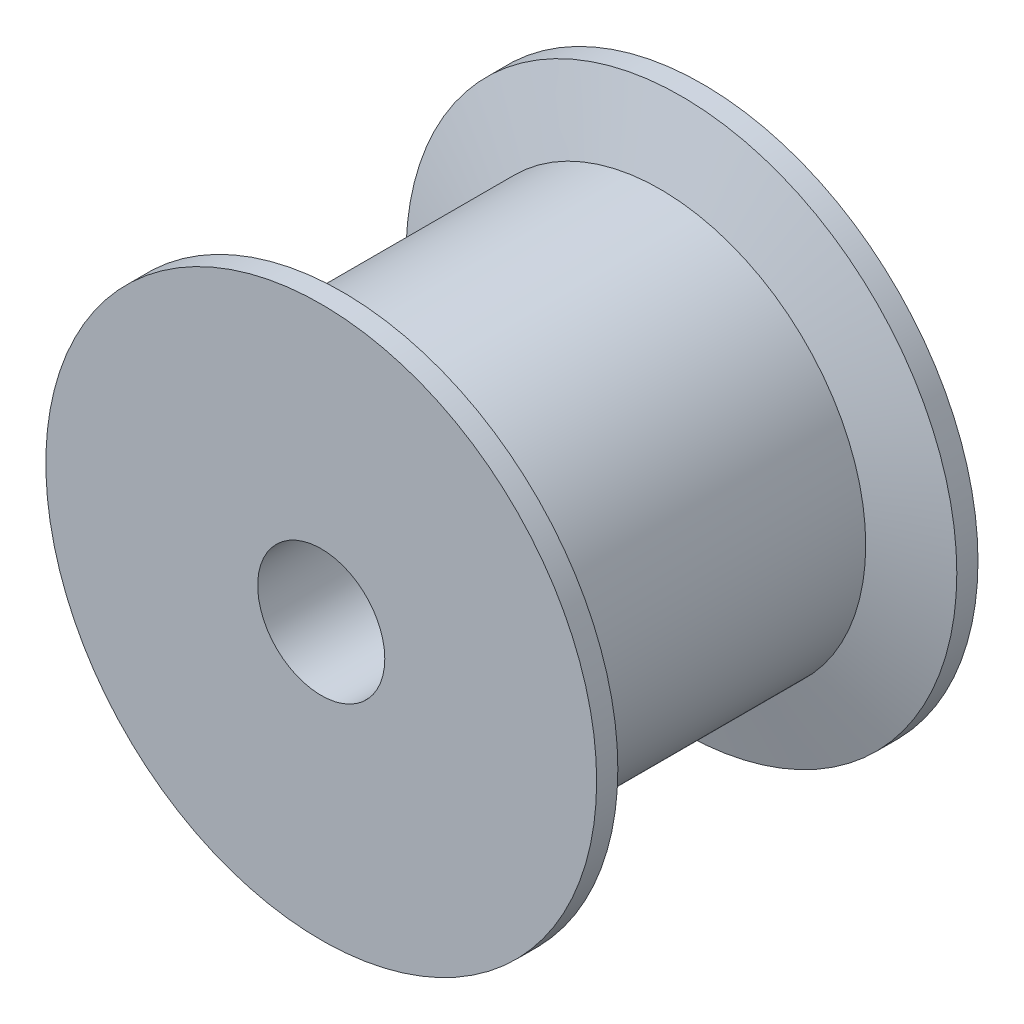
ISO-10303-21;
HEADER;
FILE_DESCRIPTION(('STEP AP214'),'2;1');
FILE_NAME('part.step','',(''),(''),'','','');
FILE_SCHEMA(('AUTOMOTIVE_DESIGN { 1 0 10303 214 1 1 1 1 }'));
ENDSEC;
DATA;
#1=APPLICATION_CONTEXT('core data for automotive mechanical design processes');
#2=APPLICATION_PROTOCOL_DEFINITION('international standard','automotive_design',2000,#1);
#3=PRODUCT_CONTEXT('',#1,'mechanical');
#4=PRODUCT('Part','Part','',(#3));
#5=PRODUCT_RELATED_PRODUCT_CATEGORY('part','',(#4));
#6=PRODUCT_DEFINITION_FORMATION('','',#4);
#7=PRODUCT_DEFINITION_CONTEXT('part definition',#1,'design');
#8=PRODUCT_DEFINITION('design','',#6,#7);
#9=PRODUCT_DEFINITION_SHAPE('','',#8);
#10=(LENGTH_UNIT() NAMED_UNIT(*) SI_UNIT(.MILLI.,.METRE.));
#11=(NAMED_UNIT(*) PLANE_ANGLE_UNIT() SI_UNIT($,.RADIAN.));
#12=(NAMED_UNIT(*) SI_UNIT($,.STERADIAN.) SOLID_ANGLE_UNIT());
#13=UNCERTAINTY_MEASURE_WITH_UNIT(LENGTH_MEASURE(1.E-05),#10,'distance_accuracy_value','');
#14=(GEOMETRIC_REPRESENTATION_CONTEXT(3) GLOBAL_UNCERTAINTY_ASSIGNED_CONTEXT((#13)) GLOBAL_UNIT_ASSIGNED_CONTEXT((#10,
#11,#12)) REPRESENTATION_CONTEXT('',''));
#15=CARTESIAN_POINT('',(0.,0.,0.));
#16=DIRECTION('',(0.,0.,1.));
#17=DIRECTION('',(1.,0.,0.));
#18=AXIS2_PLACEMENT_3D('',#15,#16,#17);
#19=CARTESIAN_POINT('',(0.,0.,3.5));
#20=DIRECTION('',(0.,0.,1.));
#21=DIRECTION('',(1.,0.,0.));
#22=AXIS2_PLACEMENT_3D('',#19,#20,#21);
#23=CONICAL_SURFACE('',#22,4.85,1.27656176168371);
#24=CARTESIAN_POINT('',(0.,0.,4.));
#25=DIRECTION('',(0.,0.,1.));
#26=DIRECTION('',(1.,0.,0.));
#27=AXIS2_PLACEMENT_3D('',#24,#25,#26);
#28=CIRCLE('',#27,6.5);
#29=CARTESIAN_POINT('',(6.5,0.,4.));
#30=VERTEX_POINT('',#29);
#31=EDGE_CURVE('E72',#30,#30,#28,.T.);
#32=ORIENTED_EDGE('',*,*,#31,.F.);
#33=EDGE_LOOP('',(#32));
#34=FACE_BOUND('',#33,.T.);
#35=CARTESIAN_POINT('',(0.,0.,3.5));
#36=DIRECTION('',(0.,0.,1.));
#37=DIRECTION('',(1.,0.,0.));
#38=AXIS2_PLACEMENT_3D('',#35,#36,#37);
#39=CIRCLE('',#38,4.85);
#40=CARTESIAN_POINT('',(4.85,0.,3.5));
#41=VERTEX_POINT('',#40);
#42=EDGE_CURVE('E10',#41,#41,#39,.T.);
#43=ORIENTED_EDGE('',*,*,#42,.T.);
#44=EDGE_LOOP('',(#43));
#45=FACE_BOUND('',#44,.T.);
#46=ADVANCED_FACE('F37',(#34,#45),#23,.T.);
#47=CARTESIAN_POINT('',(0.,0.,0.));
#48=DIRECTION('',(0.,0.,1.));
#49=DIRECTION('',(1.,0.,0.));
#50=AXIS2_PLACEMENT_3D('',#47,#48,#49);
#51=CYLINDRICAL_SURFACE('',#50,4.85);
#52=ORIENTED_EDGE('',*,*,#42,.F.);
#53=EDGE_LOOP('',(#52));
#54=FACE_BOUND('',#53,.T.);
#55=CARTESIAN_POINT('',(0.,0.,-3.5));
#56=DIRECTION('',(0.,0.,1.));
#57=DIRECTION('',(1.,0.,0.));
#58=AXIS2_PLACEMENT_3D('',#55,#56,#57);
#59=CIRCLE('',#58,4.85);
#60=CARTESIAN_POINT('',(4.85,0.,-3.5));
#61=VERTEX_POINT('',#60);
#62=EDGE_CURVE('E44',#61,#61,#59,.T.);
#63=ORIENTED_EDGE('',*,*,#62,.T.);
#64=EDGE_LOOP('',(#63));
#65=FACE_BOUND('',#64,.T.);
#66=ADVANCED_FACE('F80',(#54,#65),#51,.T.);
#67=CARTESIAN_POINT('',(0.,0.,-4.));
#68=DIRECTION('',(0.,0.,-1.));
#69=DIRECTION('',(-1.,0.,0.));
#70=AXIS2_PLACEMENT_3D('',#67,#68,#69);
#71=CONICAL_SURFACE('',#70,6.5,1.27656176168371);
#72=ORIENTED_EDGE('',*,*,#62,.F.);
#73=EDGE_LOOP('',(#72));
#74=FACE_BOUND('',#73,.T.);
#75=CARTESIAN_POINT('',(0.,0.,-4.));
#76=DIRECTION('',(0.,0.,1.));
#77=DIRECTION('',(1.,0.,0.));
#78=AXIS2_PLACEMENT_3D('',#75,#76,#77);
#79=CIRCLE('',#78,6.5);
#80=CARTESIAN_POINT('',(6.5,0.,-4.));
#81=VERTEX_POINT('',#80);
#82=EDGE_CURVE('E49',#81,#81,#79,.T.);
#83=ORIENTED_EDGE('',*,*,#82,.T.);
#84=EDGE_LOOP('',(#83));
#85=FACE_BOUND('',#84,.T.);
#86=ADVANCED_FACE('F84',(#74,#85),#71,.T.);
#87=CARTESIAN_POINT('',(0.,0.,0.));
#88=DIRECTION('',(0.,0.,1.));
#89=DIRECTION('',(1.,0.,0.));
#90=AXIS2_PLACEMENT_3D('',#87,#88,#89);
#91=CYLINDRICAL_SURFACE('',#90,6.5);
#92=ORIENTED_EDGE('',*,*,#82,.F.);
#93=EDGE_LOOP('',(#92));
#94=FACE_BOUND('',#93,.T.);
#95=CARTESIAN_POINT('',(0.,0.,-4.5));
#96=DIRECTION('',(0.,0.,1.));
#97=DIRECTION('',(1.,0.,0.));
#98=AXIS2_PLACEMENT_3D('',#95,#96,#97);
#99=CIRCLE('',#98,6.5);
#100=CARTESIAN_POINT('',(6.5,0.,-4.5));
#101=VERTEX_POINT('',#100);
#102=EDGE_CURVE('E54',#101,#101,#99,.T.);
#103=ORIENTED_EDGE('',*,*,#102,.T.);
#104=EDGE_LOOP('',(#103));
#105=FACE_BOUND('',#104,.T.);
#106=ADVANCED_FACE('F89',(#94,#105),#91,.T.);
#107=CARTESIAN_POINT('',(0.,1.5,-4.5));
#108=DIRECTION('',(0.,0.,1.));
#109=DIRECTION('',(1.,0.,0.));
#110=AXIS2_PLACEMENT_3D('',#107,#108,#109);
#111=PLANE('',#110);
#112=ORIENTED_EDGE('',*,*,#102,.F.);
#113=EDGE_LOOP('',(#112));
#114=FACE_BOUND('',#113,.T.);
#115=CARTESIAN_POINT('',(0.,0.,-4.5));
#116=DIRECTION('',(0.,0.,1.));
#117=DIRECTION('',(1.,0.,0.));
#118=AXIS2_PLACEMENT_3D('',#115,#116,#117);
#119=CIRCLE('',#118,1.5);
#120=CARTESIAN_POINT('',(1.5,0.,-4.5));
#121=VERTEX_POINT('',#120);
#122=EDGE_CURVE('E60',#121,#121,#119,.T.);
#123=ORIENTED_EDGE('',*,*,#122,.T.);
#124=EDGE_LOOP('',(#123));
#125=FACE_BOUND('',#124,.T.);
#126=ADVANCED_FACE('F95',(#114,#125),#111,.F.);
#127=CARTESIAN_POINT('',(0.,0.,0.));
#128=DIRECTION('',(0.,0.,1.));
#129=DIRECTION('',(1.,0.,0.));
#130=AXIS2_PLACEMENT_3D('',#127,#128,#129);
#131=CYLINDRICAL_SURFACE('',#130,1.5);
#132=ORIENTED_EDGE('',*,*,#122,.F.);
#133=EDGE_LOOP('',(#132));
#134=FACE_BOUND('',#133,.T.);
#135=CARTESIAN_POINT('',(0.,0.,4.5));
#136=DIRECTION('',(0.,0.,1.));
#137=DIRECTION('',(1.,0.,0.));
#138=AXIS2_PLACEMENT_3D('',#135,#136,#137);
#139=CIRCLE('',#138,1.5);
#140=CARTESIAN_POINT('',(1.5,0.,4.5));
#141=VERTEX_POINT('',#140);
#142=EDGE_CURVE('E64',#141,#141,#139,.T.);
#143=ORIENTED_EDGE('',*,*,#142,.T.);
#144=EDGE_LOOP('',(#143));
#145=FACE_BOUND('',#144,.T.);
#146=ADVANCED_FACE('F99',(#134,#145),#131,.F.);
#147=CARTESIAN_POINT('',(0.,6.5,4.5));
#148=DIRECTION('',(0.,0.,-1.));
#149=DIRECTION('',(-1.,0.,0.));
#150=AXIS2_PLACEMENT_3D('',#147,#148,#149);
#151=PLANE('',#150);
#152=ORIENTED_EDGE('',*,*,#142,.F.);
#153=EDGE_LOOP('',(#152));
#154=FACE_BOUND('',#153,.T.);
#155=CARTESIAN_POINT('',(0.,0.,4.5));
#156=DIRECTION('',(0.,0.,1.));
#157=DIRECTION('',(1.,0.,0.));
#158=AXIS2_PLACEMENT_3D('',#155,#156,#157);
#159=CIRCLE('',#158,6.5);
#160=CARTESIAN_POINT('',(6.5,0.,4.5));
#161=VERTEX_POINT('',#160);
#162=EDGE_CURVE('E68',#161,#161,#159,.T.);
#163=ORIENTED_EDGE('',*,*,#162,.T.);
#164=EDGE_LOOP('',(#163));
#165=FACE_BOUND('',#164,.T.);
#166=ADVANCED_FACE('F103',(#154,#165),#151,.F.);
#167=CARTESIAN_POINT('',(0.,0.,0.));
#168=DIRECTION('',(0.,0.,1.));
#169=DIRECTION('',(1.,0.,0.));
#170=AXIS2_PLACEMENT_3D('',#167,#168,#169);
#171=CYLINDRICAL_SURFACE('',#170,6.5);
#172=ORIENTED_EDGE('',*,*,#162,.F.);
#173=EDGE_LOOP('',(#172));
#174=FACE_BOUND('',#173,.T.);
#175=ORIENTED_EDGE('',*,*,#31,.T.);
#176=EDGE_LOOP('',(#175));
#177=FACE_BOUND('',#176,.T.);
#178=ADVANCED_FACE('F77',(#174,#177),#171,.T.);
#179=CLOSED_SHELL('',(#46,#66,#86,#106,#126,#146,#166,#178));
#180=MANIFOLD_SOLID_BREP('B2',#179);
#181=ADVANCED_BREP_SHAPE_REPRESENTATION('',(#18,#180),#14);
#182=SHAPE_DEFINITION_REPRESENTATION(#9,#181);
ENDSEC;
END-ISO-10303-21;
